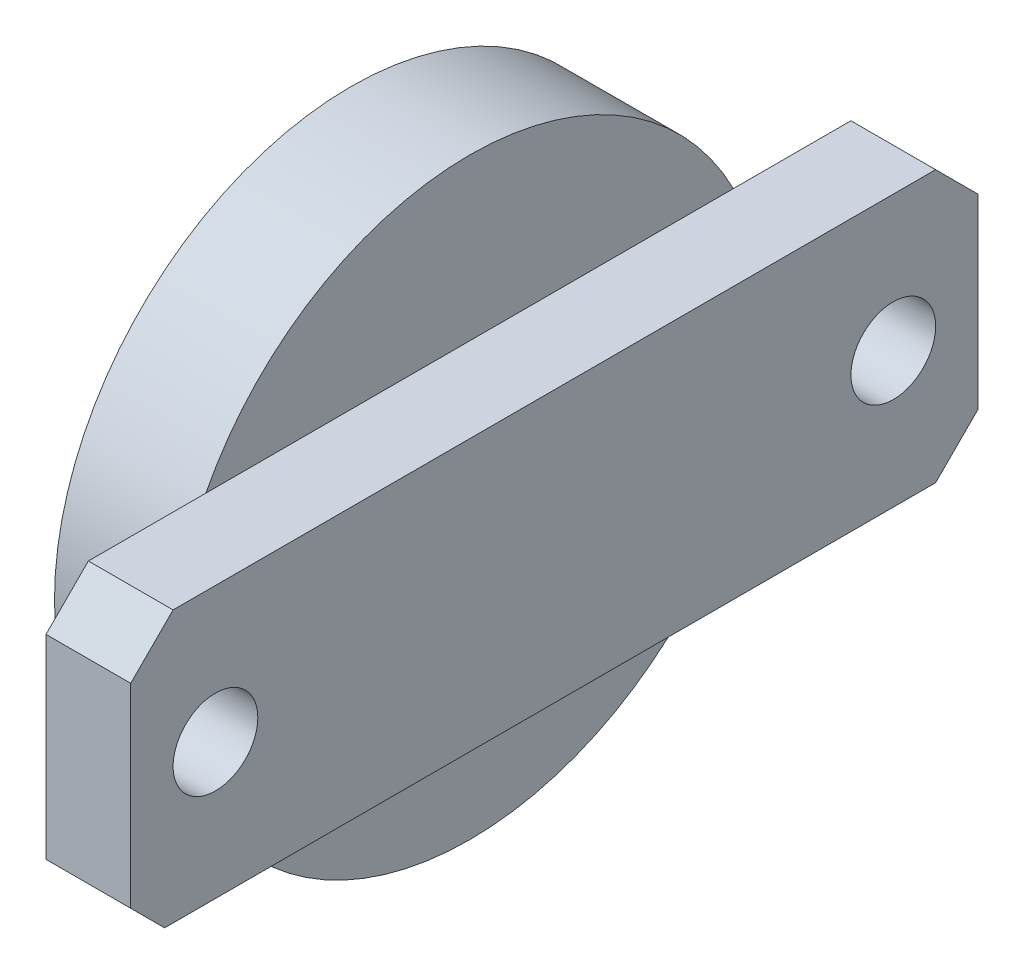
ISO-10303-21;
HEADER;
FILE_DESCRIPTION(('STEP AP214'),'2;1');
FILE_NAME('part.step','',(''),(''),'','','');
FILE_SCHEMA(('AUTOMOTIVE_DESIGN { 1 0 10303 214 1 1 1 1 }'));
ENDSEC;
DATA;
#1=APPLICATION_CONTEXT('core data for automotive mechanical design processes');
#2=APPLICATION_PROTOCOL_DEFINITION('international standard','automotive_design',2000,#1);
#3=PRODUCT_CONTEXT('',#1,'mechanical');
#4=PRODUCT('Part','Part','',(#3));
#5=PRODUCT_RELATED_PRODUCT_CATEGORY('part','',(#4));
#6=PRODUCT_DEFINITION_FORMATION('','',#4);
#7=PRODUCT_DEFINITION_CONTEXT('part definition',#1,'design');
#8=PRODUCT_DEFINITION('design','',#6,#7);
#9=PRODUCT_DEFINITION_SHAPE('','',#8);
#10=(LENGTH_UNIT() NAMED_UNIT(*) SI_UNIT(.MILLI.,.METRE.));
#11=(NAMED_UNIT(*) PLANE_ANGLE_UNIT() SI_UNIT($,.RADIAN.));
#12=(NAMED_UNIT(*) SI_UNIT($,.STERADIAN.) SOLID_ANGLE_UNIT());
#13=UNCERTAINTY_MEASURE_WITH_UNIT(LENGTH_MEASURE(1.E-05),#10,'distance_accuracy_value','');
#14=(GEOMETRIC_REPRESENTATION_CONTEXT(3) GLOBAL_UNCERTAINTY_ASSIGNED_CONTEXT((#13)) GLOBAL_UNIT_ASSIGNED_CONTEXT((#10,
#11,#12)) REPRESENTATION_CONTEXT('',''));
#15=CARTESIAN_POINT('',(0.,0.,0.));
#16=DIRECTION('',(0.,0.,1.));
#17=DIRECTION('',(1.,0.,0.));
#18=AXIS2_PLACEMENT_3D('',#15,#16,#17);
#19=CARTESIAN_POINT('',(0.,0.,0.));
#20=DIRECTION('',(1.,0.,0.));
#21=DIRECTION('',(0.,0.,-1.));
#22=AXIS2_PLACEMENT_3D('',#19,#20,#21);
#23=PLANE('',#22);
#24=CARTESIAN_POINT('',(0.,0.,-20.));
#25=DIRECTION('',(1.,0.,0.));
#26=DIRECTION('',(0.,0.,-1.));
#27=AXIS2_PLACEMENT_3D('',#24,#25,#26);
#28=CIRCLE('',#27,2.49999999999999);
#29=CARTESIAN_POINT('',(0.,0.,-17.5));
#30=VERTEX_POINT('',#29);
#31=EDGE_CURVE('E171',#30,#30,#28,.T.);
#32=ORIENTED_EDGE('',*,*,#31,.T.);
#33=CARTESIAN_POINT('',(0.,0.,0.));
#34=DIRECTION('',(-1.,0.,0.));
#35=DIRECTION('',(0.,0.,1.));
#36=AXIS2_PLACEMENT_3D('',#33,#34,#35);
#37=CIRCLE('',#36,17.5);
#38=CARTESIAN_POINT('',(0.,8.,-15.5643824162734));
#39=VERTEX_POINT('',#38);
#40=EDGE_CURVE('E268',#39,#30,#37,.T.);
#41=ORIENTED_EDGE('',*,*,#40,.F.);
#42=DIRECTION('',(0.,0.,1.));
#43=VECTOR('',#42,1.);
#44=CARTESIAN_POINT('',(0.,8.,-25.));
#45=LINE('',#44,#43);
#46=CARTESIAN_POINT('',(0.,8.,-22.5));
#47=VERTEX_POINT('',#46);
#48=EDGE_CURVE('E168',#47,#39,#45,.T.);
#49=ORIENTED_EDGE('',*,*,#48,.F.);
#50=DIRECTION('',(0.,0.707106781186544,0.707106781186551));
#51=VECTOR('',#50,1.);
#52=CARTESIAN_POINT('',(0.,5.50000000000001,-25.));
#53=LINE('',#52,#51);
#54=CARTESIAN_POINT('',(0.,5.50000000000001,-25.));
#55=VERTEX_POINT('',#54);
#56=EDGE_CURVE('E187',#47,#55,#53,.F.);
#57=ORIENTED_EDGE('',*,*,#56,.T.);
#58=DIRECTION('',(0.,1.,0.));
#59=VECTOR('',#58,1.);
#60=CARTESIAN_POINT('',(0.,-8.,-25.));
#61=LINE('',#60,#59);
#62=CARTESIAN_POINT('',(0.,-5.49999999999999,-25.));
#63=VERTEX_POINT('',#62);
#64=EDGE_CURVE('E223',#63,#55,#61,.T.);
#65=ORIENTED_EDGE('',*,*,#64,.F.);
#66=DIRECTION('',(0.,0.70710678118655,-0.707106781186545));
#67=VECTOR('',#66,1.);
#68=CARTESIAN_POINT('',(0.,-8.,-22.5));
#69=LINE('',#68,#67);
#70=CARTESIAN_POINT('',(0.,-8.,-22.5));
#71=VERTEX_POINT('',#70);
#72=EDGE_CURVE('E160',#63,#71,#69,.F.);
#73=ORIENTED_EDGE('',*,*,#72,.T.);
#74=DIRECTION('',(0.,0.,-1.));
#75=VECTOR('',#74,1.);
#76=CARTESIAN_POINT('',(0.,-8.,25.));
#77=LINE('',#76,#75);
#78=CARTESIAN_POINT('',(0.,-8.,-15.5643824162734));
#79=VERTEX_POINT('',#78);
#80=EDGE_CURVE('E225',#79,#71,#77,.T.);
#81=ORIENTED_EDGE('',*,*,#80,.F.);
#82=EDGE_CURVE('E272',#30,#79,#37,.T.);
#83=ORIENTED_EDGE('',*,*,#82,.F.);
#84=EDGE_LOOP('',(#32,#41,#49,#57,#65,#73,#81,#83));
#85=FACE_BOUND('',#84,.T.);
#86=ADVANCED_FACE('F47',(#85),#23,.F.);
#87=CARTESIAN_POINT('',(0.,-8.,25.));
#88=DIRECTION('',(0.,-1.,0.));
#89=DIRECTION('',(0.,0.,-1.));
#90=AXIS2_PLACEMENT_3D('',#87,#88,#89);
#91=PLANE('',#90);
#92=DIRECTION('',(0.,0.,-1.));
#93=VECTOR('',#92,1.);
#94=CARTESIAN_POINT('',(5.,-8.,25.));
#95=LINE('',#94,#93);
#96=CARTESIAN_POINT('',(5.,-8.,23.));
#97=VERTEX_POINT('',#96);
#98=CARTESIAN_POINT('',(5.,-8.,-22.5));
#99=VERTEX_POINT('',#98);
#100=EDGE_CURVE('E137',#97,#99,#95,.T.);
#101=ORIENTED_EDGE('',*,*,#100,.F.);
#102=DIRECTION('',(-1.,0.,0.));
#103=VECTOR('',#102,1.);
#104=CARTESIAN_POINT('',(0.,-8.,23.));
#105=LINE('',#104,#103);
#106=CARTESIAN_POINT('',(0.,-8.,23.));
#107=VERTEX_POINT('',#106);
#108=EDGE_CURVE('E57',#97,#107,#105,.T.);
#109=ORIENTED_EDGE('',*,*,#108,.T.);
#110=CARTESIAN_POINT('',(0.,-8.,15.5643824162734));
#111=VERTEX_POINT('',#110);
#112=EDGE_CURVE('E210',#107,#111,#77,.T.);
#113=ORIENTED_EDGE('',*,*,#112,.T.);
#114=EDGE_CURVE('E64',#111,#79,#77,.T.);
#115=ORIENTED_EDGE('',*,*,#114,.T.);
#116=ORIENTED_EDGE('',*,*,#80,.T.);
#117=DIRECTION('',(1.,0.,0.));
#118=VECTOR('',#117,1.);
#119=CARTESIAN_POINT('',(0.,-8.,-22.5));
#120=LINE('',#119,#118);
#121=EDGE_CURVE('E190',#71,#99,#120,.T.);
#122=ORIENTED_EDGE('',*,*,#121,.T.);
#123=EDGE_LOOP('',(#101,#109,#113,#115,#116,#122));
#124=FACE_BOUND('',#123,.T.);
#125=ADVANCED_FACE('F209',(#124),#91,.T.);
#126=CARTESIAN_POINT('',(0.,7.99999999999998,25.));
#127=DIRECTION('',(0.,0.,1.));
#128=DIRECTION('',(1.,0.,0.));
#129=AXIS2_PLACEMENT_3D('',#126,#127,#128);
#130=PLANE('',#129);
#131=DIRECTION('',(0.,-1.,0.));
#132=VECTOR('',#131,1.);
#133=CARTESIAN_POINT('',(0.,7.99999999999998,25.));
#134=LINE('',#133,#132);
#135=CARTESIAN_POINT('',(0.,5.49999999999996,25.));
#136=VERTEX_POINT('',#135);
#137=CARTESIAN_POINT('',(0.,-6.00000000000001,25.));
#138=VERTEX_POINT('',#137);
#139=EDGE_CURVE('E162',#136,#138,#134,.T.);
#140=ORIENTED_EDGE('',*,*,#139,.T.);
#141=DIRECTION('',(1.,0.,0.));
#142=VECTOR('',#141,1.);
#143=CARTESIAN_POINT('',(0.,-6.00000000000001,25.));
#144=LINE('',#143,#142);
#145=CARTESIAN_POINT('',(5.,-6.00000000000001,25.));
#146=VERTEX_POINT('',#145);
#147=EDGE_CURVE('E200',#138,#146,#144,.T.);
#148=ORIENTED_EDGE('',*,*,#147,.T.);
#149=DIRECTION('',(0.,-1.,0.));
#150=VECTOR('',#149,1.);
#151=CARTESIAN_POINT('',(5.,7.99999999999998,25.));
#152=LINE('',#151,#150);
#153=CARTESIAN_POINT('',(5.,5.49999999999996,25.));
#154=VERTEX_POINT('',#153);
#155=EDGE_CURVE('E230',#154,#146,#152,.T.);
#156=ORIENTED_EDGE('',*,*,#155,.F.);
#157=DIRECTION('',(-1.,0.,0.));
#158=VECTOR('',#157,1.);
#159=CARTESIAN_POINT('',(0.,5.49999999999996,25.));
#160=LINE('',#159,#158);
#161=EDGE_CURVE('E193',#154,#136,#160,.T.);
#162=ORIENTED_EDGE('',*,*,#161,.T.);
#163=EDGE_LOOP('',(#140,#148,#156,#162));
#164=FACE_BOUND('',#163,.T.);
#165=ADVANCED_FACE('F229',(#164),#130,.T.);
#166=CARTESIAN_POINT('',(0.,8.,-25.));
#167=DIRECTION('',(0.,1.,0.));
#168=DIRECTION('',(0.,0.,1.));
#169=AXIS2_PLACEMENT_3D('',#166,#167,#168);
#170=PLANE('',#169);
#171=DIRECTION('',(0.,0.,1.));
#172=VECTOR('',#171,1.);
#173=CARTESIAN_POINT('',(5.,8.,-25.));
#174=LINE('',#173,#172);
#175=CARTESIAN_POINT('',(5.,8.,-22.5));
#176=VERTEX_POINT('',#175);
#177=CARTESIAN_POINT('',(5.,7.99999999999998,22.5));
#178=VERTEX_POINT('',#177);
#179=EDGE_CURVE('E155',#176,#178,#174,.T.);
#180=ORIENTED_EDGE('',*,*,#179,.F.);
#181=DIRECTION('',(-1.,0.,0.));
#182=VECTOR('',#181,1.);
#183=CARTESIAN_POINT('',(0.,8.,-22.5));
#184=LINE('',#183,#182);
#185=EDGE_CURVE('E182',#176,#47,#184,.T.);
#186=ORIENTED_EDGE('',*,*,#185,.T.);
#187=ORIENTED_EDGE('',*,*,#48,.T.);
#188=CARTESIAN_POINT('',(0.,7.99999999999998,15.5643824162734));
#189=VERTEX_POINT('',#188);
#190=EDGE_CURVE('E71',#39,#189,#45,.T.);
#191=ORIENTED_EDGE('',*,*,#190,.T.);
#192=CARTESIAN_POINT('',(0.,7.99999999999998,22.5));
#193=VERTEX_POINT('',#192);
#194=EDGE_CURVE('E243',#189,#193,#45,.T.);
#195=ORIENTED_EDGE('',*,*,#194,.T.);
#196=DIRECTION('',(1.,0.,0.));
#197=VECTOR('',#196,1.);
#198=CARTESIAN_POINT('',(0.,7.99999999999998,22.5));
#199=LINE('',#198,#197);
#200=EDGE_CURVE('E178',#193,#178,#199,.T.);
#201=ORIENTED_EDGE('',*,*,#200,.T.);
#202=EDGE_LOOP('',(#180,#186,#187,#191,#195,#201));
#203=FACE_BOUND('',#202,.T.);
#204=ADVANCED_FACE('F287',(#203),#170,.T.);
#205=CARTESIAN_POINT('',(0.,-8.,-25.));
#206=DIRECTION('',(0.,0.,-1.));
#207=DIRECTION('',(-1.,0.,0.));
#208=AXIS2_PLACEMENT_3D('',#205,#206,#207);
#209=PLANE('',#208);
#210=ORIENTED_EDGE('',*,*,#64,.T.);
#211=DIRECTION('',(1.,0.,0.));
#212=VECTOR('',#211,1.);
#213=CARTESIAN_POINT('',(0.,5.50000000000001,-25.));
#214=LINE('',#213,#212);
#215=CARTESIAN_POINT('',(5.,5.50000000000001,-25.));
#216=VERTEX_POINT('',#215);
#217=EDGE_CURVE('E153',#55,#216,#214,.T.);
#218=ORIENTED_EDGE('',*,*,#217,.T.);
#219=DIRECTION('',(0.,1.,0.));
#220=VECTOR('',#219,1.);
#221=CARTESIAN_POINT('',(5.,-8.,-25.));
#222=LINE('',#221,#220);
#223=CARTESIAN_POINT('',(5.,-5.49999999999999,-25.));
#224=VERTEX_POINT('',#223);
#225=EDGE_CURVE('E135',#224,#216,#222,.T.);
#226=ORIENTED_EDGE('',*,*,#225,.F.);
#227=DIRECTION('',(-1.,0.,0.));
#228=VECTOR('',#227,1.);
#229=CARTESIAN_POINT('',(0.,-5.49999999999999,-25.));
#230=LINE('',#229,#228);
#231=EDGE_CURVE('E150',#224,#63,#230,.T.);
#232=ORIENTED_EDGE('',*,*,#231,.T.);
#233=EDGE_LOOP('',(#210,#218,#226,#232));
#234=FACE_BOUND('',#233,.T.);
#235=ADVANCED_FACE('F149',(#234),#209,.T.);
#236=ORIENTED_EDGE('',*,*,#194,.F.);
#237=CARTESIAN_POINT('',(0.,0.,17.5));
#238=VERTEX_POINT('',#237);
#239=EDGE_CURVE('E257',#238,#189,#37,.T.);
#240=ORIENTED_EDGE('',*,*,#239,.F.);
#241=CARTESIAN_POINT('',(0.,0.,20.));
#242=DIRECTION('',(1.,0.,0.));
#243=DIRECTION('',(0.,0.,-1.));
#244=AXIS2_PLACEMENT_3D('',#241,#242,#243);
#245=CIRCLE('',#244,2.49999999999999);
#246=EDGE_CURVE('E250',#238,#238,#245,.T.);
#247=ORIENTED_EDGE('',*,*,#246,.T.);
#248=EDGE_CURVE('E221',#111,#238,#37,.T.);
#249=ORIENTED_EDGE('',*,*,#248,.F.);
#250=ORIENTED_EDGE('',*,*,#112,.F.);
#251=DIRECTION('',(0.,-0.707106781186546,-0.707106781186549));
#252=VECTOR('',#251,1.);
#253=CARTESIAN_POINT('',(0.,-6.00000000000001,25.));
#254=LINE('',#253,#252);
#255=EDGE_CURVE('E11',#107,#138,#254,.F.);
#256=ORIENTED_EDGE('',*,*,#255,.T.);
#257=ORIENTED_EDGE('',*,*,#139,.F.);
#258=DIRECTION('',(0.,-0.707106781186551,0.707106781186544));
#259=VECTOR('',#258,1.);
#260=CARTESIAN_POINT('',(0.,7.99999999999998,22.5));
#261=LINE('',#260,#259);
#262=EDGE_CURVE('E196',#136,#193,#261,.F.);
#263=ORIENTED_EDGE('',*,*,#262,.T.);
#264=EDGE_LOOP('',(#236,#240,#247,#249,#250,#256,#257,#263));
#265=FACE_BOUND('',#264,.T.);
#266=ADVANCED_FACE('F217',(#265),#23,.F.);
#267=CARTESIAN_POINT('',(5.,0.,0.));
#268=DIRECTION('',(1.,0.,0.));
#269=DIRECTION('',(0.,0.,-1.));
#270=AXIS2_PLACEMENT_3D('',#267,#268,#269);
#271=PLANE('',#270);
#272=CARTESIAN_POINT('',(5.,0.,20.));
#273=DIRECTION('',(1.,0.,0.));
#274=DIRECTION('',(0.,0.,-1.));
#275=AXIS2_PLACEMENT_3D('',#272,#273,#274);
#276=CIRCLE('',#275,2.49999999999999);
#277=CARTESIAN_POINT('',(5.,0.,17.5));
#278=VERTEX_POINT('',#277);
#279=EDGE_CURVE('E253',#278,#278,#276,.T.);
#280=ORIENTED_EDGE('',*,*,#279,.F.);
#281=EDGE_LOOP('',(#280));
#282=FACE_BOUND('',#281,.T.);
#283=CARTESIAN_POINT('',(5.,0.,-20.));
#284=DIRECTION('',(1.,0.,0.));
#285=DIRECTION('',(0.,0.,-1.));
#286=AXIS2_PLACEMENT_3D('',#283,#284,#285);
#287=CIRCLE('',#286,2.49999999999999);
#288=CARTESIAN_POINT('',(5.,0.,-22.5));
#289=VERTEX_POINT('',#288);
#290=EDGE_CURVE('E246',#289,#289,#287,.T.);
#291=ORIENTED_EDGE('',*,*,#290,.F.);
#292=EDGE_LOOP('',(#291));
#293=FACE_BOUND('',#292,.T.);
#294=ORIENTED_EDGE('',*,*,#155,.T.);
#295=DIRECTION('',(0.,0.707106781186546,0.707106781186549));
#296=VECTOR('',#295,1.);
#297=CARTESIAN_POINT('',(5.,-15.5,15.5));
#298=LINE('',#297,#296);
#299=EDGE_CURVE('E204',#146,#97,#298,.F.);
#300=ORIENTED_EDGE('',*,*,#299,.T.);
#301=ORIENTED_EDGE('',*,*,#100,.T.);
#302=DIRECTION('',(0.,-0.70710678118655,0.707106781186545));
#303=VECTOR('',#302,1.);
#304=CARTESIAN_POINT('',(5.,-15.25,-15.2500000000001));
#305=LINE('',#304,#303);
#306=EDGE_CURVE('E131',#99,#224,#305,.F.);
#307=ORIENTED_EDGE('',*,*,#306,.T.);
#308=ORIENTED_EDGE('',*,*,#225,.T.);
#309=DIRECTION('',(0.,-0.707106781186544,-0.707106781186551));
#310=VECTOR('',#309,1.);
#311=CARTESIAN_POINT('',(5.,15.25,-15.2499999999999));
#312=LINE('',#311,#310);
#313=EDGE_CURVE('E143',#216,#176,#312,.F.);
#314=ORIENTED_EDGE('',*,*,#313,.T.);
#315=ORIENTED_EDGE('',*,*,#179,.T.);
#316=DIRECTION('',(0.,0.707106781186551,-0.707106781186544));
#317=VECTOR('',#316,1.);
#318=CARTESIAN_POINT('',(5.,15.25,15.2500000000001));
#319=LINE('',#318,#317);
#320=EDGE_CURVE('E144',#178,#154,#319,.F.);
#321=ORIENTED_EDGE('',*,*,#320,.T.);
#322=EDGE_LOOP('',(#294,#300,#301,#307,#308,#314,#315,#321));
#323=FACE_BOUND('',#322,.T.);
#324=ADVANCED_FACE('F134',(#282,#293,#323),#271,.T.);
#325=CARTESIAN_POINT('',(0.,14.,0.));
#326=DIRECTION('',(1.,0.,0.));
#327=DIRECTION('',(0.,0.,-1.));
#328=AXIS2_PLACEMENT_3D('',#325,#326,#327);
#329=PLANE('',#328);
#330=ORIENTED_EDGE('',*,*,#114,.F.);
#331=EDGE_CURVE('E270',#79,#111,#37,.T.);
#332=ORIENTED_EDGE('',*,*,#331,.F.);
#333=EDGE_LOOP('',(#330,#332));
#334=FACE_BOUND('',#333,.T.);
#335=ADVANCED_FACE('F292',(#334),#329,.T.);
#336=ORIENTED_EDGE('',*,*,#190,.F.);
#337=EDGE_CURVE('E264',#189,#39,#37,.T.);
#338=ORIENTED_EDGE('',*,*,#337,.F.);
#339=EDGE_LOOP('',(#336,#338));
#340=FACE_BOUND('',#339,.T.);
#341=ADVANCED_FACE('F352',(#340),#329,.T.);
#342=CARTESIAN_POINT('',(5.,0.,-20.));
#343=DIRECTION('',(1.,0.,0.));
#344=DIRECTION('',(0.,0.,-1.));
#345=AXIS2_PLACEMENT_3D('',#342,#343,#344);
#346=CYLINDRICAL_SURFACE('',#345,2.49999999999999);
#347=ORIENTED_EDGE('',*,*,#290,.T.);
#348=EDGE_LOOP('',(#347));
#349=FACE_BOUND('',#348,.T.);
#350=ORIENTED_EDGE('',*,*,#31,.F.);
#351=EDGE_LOOP('',(#350));
#352=FACE_BOUND('',#351,.T.);
#353=ADVANCED_FACE('F345',(#349,#352),#346,.F.);
#354=CARTESIAN_POINT('',(5.,0.,20.));
#355=DIRECTION('',(1.,0.,0.));
#356=DIRECTION('',(0.,0.,-1.));
#357=AXIS2_PLACEMENT_3D('',#354,#355,#356);
#358=CYLINDRICAL_SURFACE('',#357,2.49999999999999);
#359=ORIENTED_EDGE('',*,*,#279,.T.);
#360=EDGE_LOOP('',(#359));
#361=FACE_BOUND('',#360,.T.);
#362=ORIENTED_EDGE('',*,*,#246,.F.);
#363=EDGE_LOOP('',(#362));
#364=FACE_BOUND('',#363,.T.);
#365=ADVANCED_FACE('F335',(#361,#364),#358,.F.);
#366=CARTESIAN_POINT('',(0.,5.50000000000001,-25.));
#367=DIRECTION('',(0.,-0.707106781186551,0.707106781186544));
#368=DIRECTION('',(1.,0.,0.));
#369=AXIS2_PLACEMENT_3D('',#366,#367,#368);
#370=PLANE('',#369);
#371=ORIENTED_EDGE('',*,*,#56,.F.);
#372=ORIENTED_EDGE('',*,*,#185,.F.);
#373=ORIENTED_EDGE('',*,*,#313,.F.);
#374=ORIENTED_EDGE('',*,*,#217,.F.);
#375=EDGE_LOOP('',(#371,#372,#373,#374));
#376=FACE_BOUND('',#375,.T.);
#377=ADVANCED_FACE('F290',(#376),#370,.F.);
#378=CARTESIAN_POINT('',(0.,-8.,-22.5));
#379=DIRECTION('',(0.,0.707106781186545,0.70710678118655));
#380=DIRECTION('',(1.,0.,0.));
#381=AXIS2_PLACEMENT_3D('',#378,#379,#380);
#382=PLANE('',#381);
#383=ORIENTED_EDGE('',*,*,#72,.F.);
#384=ORIENTED_EDGE('',*,*,#231,.F.);
#385=ORIENTED_EDGE('',*,*,#306,.F.);
#386=ORIENTED_EDGE('',*,*,#121,.F.);
#387=EDGE_LOOP('',(#383,#384,#385,#386));
#388=FACE_BOUND('',#387,.T.);
#389=ADVANCED_FACE('F158',(#388),#382,.F.);
#390=CARTESIAN_POINT('',(0.,7.99999999999998,22.5));
#391=DIRECTION('',(0.,-0.707106781186544,-0.707106781186551));
#392=DIRECTION('',(1.,0.,0.));
#393=AXIS2_PLACEMENT_3D('',#390,#391,#392);
#394=PLANE('',#393);
#395=ORIENTED_EDGE('',*,*,#262,.F.);
#396=ORIENTED_EDGE('',*,*,#161,.F.);
#397=ORIENTED_EDGE('',*,*,#320,.F.);
#398=ORIENTED_EDGE('',*,*,#200,.F.);
#399=EDGE_LOOP('',(#395,#396,#397,#398));
#400=FACE_BOUND('',#399,.T.);
#401=ADVANCED_FACE('F299',(#400),#394,.F.);
#402=CARTESIAN_POINT('',(0.,-6.00000000000001,25.));
#403=DIRECTION('',(0.,0.707106781186549,-0.707106781186546));
#404=DIRECTION('',(1.,0.,0.));
#405=AXIS2_PLACEMENT_3D('',#402,#403,#404);
#406=PLANE('',#405);
#407=ORIENTED_EDGE('',*,*,#255,.F.);
#408=ORIENTED_EDGE('',*,*,#108,.F.);
#409=ORIENTED_EDGE('',*,*,#299,.F.);
#410=ORIENTED_EDGE('',*,*,#147,.F.);
#411=EDGE_LOOP('',(#407,#408,#409,#410));
#412=FACE_BOUND('',#411,.T.);
#413=ADVANCED_FACE('F50',(#412),#406,.F.);
#414=CARTESIAN_POINT('',(0.,0.,0.));
#415=DIRECTION('',(-1.,0.,0.));
#416=DIRECTION('',(0.,0.,1.));
#417=AXIS2_PLACEMENT_3D('',#414,#415,#416);
#418=CYLINDRICAL_SURFACE('',#417,17.5);
#419=ORIENTED_EDGE('',*,*,#239,.T.);
#420=ORIENTED_EDGE('',*,*,#337,.T.);
#421=ORIENTED_EDGE('',*,*,#40,.T.);
#422=ORIENTED_EDGE('',*,*,#82,.T.);
#423=ORIENTED_EDGE('',*,*,#331,.T.);
#424=ORIENTED_EDGE('',*,*,#248,.T.);
#425=EDGE_LOOP('',(#419,#420,#421,#422,#423,#424));
#426=FACE_BOUND('',#425,.T.);
#427=CARTESIAN_POINT('',(-7.,0.,0.));
#428=DIRECTION('',(-1.,0.,0.));
#429=DIRECTION('',(0.,0.,1.));
#430=AXIS2_PLACEMENT_3D('',#427,#428,#429);
#431=CIRCLE('',#430,17.5);
#432=CARTESIAN_POINT('',(-7.,0.,17.5));
#433=VERTEX_POINT('',#432);
#434=EDGE_CURVE('E258',#433,#433,#431,.T.);
#435=ORIENTED_EDGE('',*,*,#434,.F.);
#436=EDGE_LOOP('',(#435));
#437=FACE_BOUND('',#436,.T.);
#438=ADVANCED_FACE('F278',(#426,#437),#418,.T.);
#439=CARTESIAN_POINT('',(-7.,0.,0.));
#440=DIRECTION('',(-1.,0.,0.));
#441=DIRECTION('',(0.,0.,1.));
#442=AXIS2_PLACEMENT_3D('',#439,#440,#441);
#443=PLANE('',#442);
#444=ORIENTED_EDGE('',*,*,#434,.T.);
#445=EDGE_LOOP('',(#444));
#446=FACE_BOUND('',#445,.T.);
#447=ADVANCED_FACE('F358',(#446),#443,.T.);
#448=CLOSED_SHELL('',(#86,#125,#165,#204,#235,#266,#324,#335,#341,#353,#365,#377,#389,#401,#413,
#438,#447));
#449=MANIFOLD_SOLID_BREP('B2',#448);
#450=ADVANCED_BREP_SHAPE_REPRESENTATION('',(#18,#449),#14);
#451=SHAPE_DEFINITION_REPRESENTATION(#9,#450);
ENDSEC;
END-ISO-10303-21;
